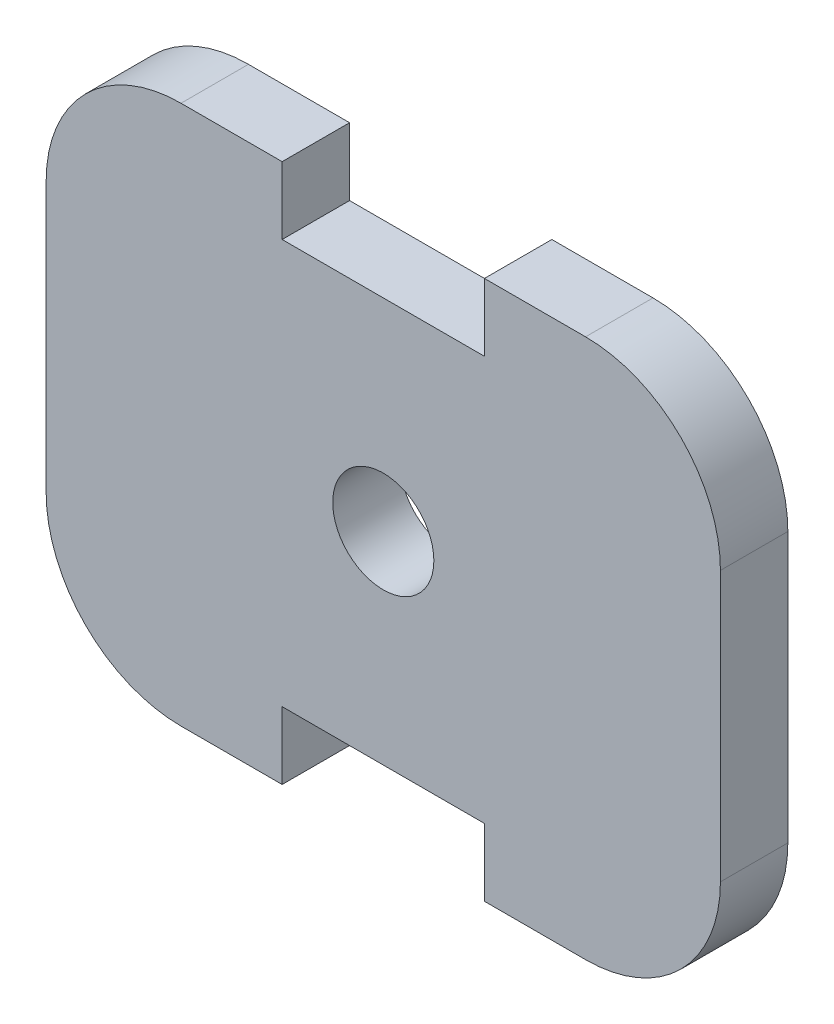
ISO-10303-21;
HEADER;
FILE_DESCRIPTION(('STEP AP214'),'2;1');
FILE_NAME('part.step','',(''),(''),'','','');
FILE_SCHEMA(('AUTOMOTIVE_DESIGN { 1 0 10303 214 1 1 1 1 }'));
ENDSEC;
DATA;
#1=APPLICATION_CONTEXT('core data for automotive mechanical design processes');
#2=APPLICATION_PROTOCOL_DEFINITION('international standard','automotive_design',2000,#1);
#3=PRODUCT_CONTEXT('',#1,'mechanical');
#4=PRODUCT('Part','Part','',(#3));
#5=PRODUCT_RELATED_PRODUCT_CATEGORY('part','',(#4));
#6=PRODUCT_DEFINITION_FORMATION('','',#4);
#7=PRODUCT_DEFINITION_CONTEXT('part definition',#1,'design');
#8=PRODUCT_DEFINITION('design','',#6,#7);
#9=PRODUCT_DEFINITION_SHAPE('','',#8);
#10=(LENGTH_UNIT() NAMED_UNIT(*) SI_UNIT(.MILLI.,.METRE.));
#11=(NAMED_UNIT(*) PLANE_ANGLE_UNIT() SI_UNIT($,.RADIAN.));
#12=(NAMED_UNIT(*) SI_UNIT($,.STERADIAN.) SOLID_ANGLE_UNIT());
#13=UNCERTAINTY_MEASURE_WITH_UNIT(LENGTH_MEASURE(1.E-05),#10,'distance_accuracy_value','');
#14=(GEOMETRIC_REPRESENTATION_CONTEXT(3) GLOBAL_UNCERTAINTY_ASSIGNED_CONTEXT((#13)) GLOBAL_UNIT_ASSIGNED_CONTEXT((#10,
#11,#12)) REPRESENTATION_CONTEXT('',''));
#15=CARTESIAN_POINT('',(0.,0.,0.));
#16=DIRECTION('',(0.,0.,1.));
#17=DIRECTION('',(1.,0.,0.));
#18=AXIS2_PLACEMENT_3D('',#15,#16,#17);
#19=CARTESIAN_POINT('',(-3.175,2.08700615845026,3.175));
#20=DIRECTION('',(0.,0.,-1.));
#21=DIRECTION('',(-1.,0.,0.));
#22=AXIS2_PLACEMENT_3D('',#19,#20,#21);
#23=PLANE('',#22);
#24=CARTESIAN_POINT('',(-3.175,2.08700615845026,3.175));
#25=DIRECTION('',(0.,0.,1.));
#26=DIRECTION('',(-1.,0.,0.));
#27=AXIS2_PLACEMENT_3D('',#24,#25,#26);
#28=CIRCLE('',#27,6.35);
#29=CARTESIAN_POINT('',(-9.525,2.08700615845026,3.175));
#30=VERTEX_POINT('',#29);
#31=CARTESIAN_POINT('',(-3.17499999999999,-4.26299384154974,3.175));
#32=VERTEX_POINT('',#31);
#33=EDGE_CURVE('E209',#30,#32,#28,.T.);
#34=ORIENTED_EDGE('',*,*,#33,.T.);
#35=DIRECTION('',(1.,0.,0.));
#36=VECTOR('',#35,1.);
#37=CARTESIAN_POINT('',(1.5875,-4.26299384154974,3.175));
#38=LINE('',#37,#36);
#39=CARTESIAN_POINT('',(1.5875,-4.26299384154974,3.175));
#40=VERTEX_POINT('',#39);
#41=EDGE_CURVE('E117',#32,#40,#38,.T.);
#42=ORIENTED_EDGE('',*,*,#41,.T.);
#43=DIRECTION('',(0.,1.,0.));
#44=VECTOR('',#43,1.);
#45=CARTESIAN_POINT('',(1.5875,-4.26299384154974,3.175));
#46=LINE('',#45,#44);
#47=CARTESIAN_POINT('',(1.5875,-1.08799384154974,3.175));
#48=VERTEX_POINT('',#47);
#49=EDGE_CURVE('E248',#40,#48,#46,.T.);
#50=ORIENTED_EDGE('',*,*,#49,.T.);
#51=DIRECTION('',(1.,0.,0.));
#52=VECTOR('',#51,1.);
#53=CARTESIAN_POINT('',(1.5875,-1.08799384154974,3.175));
#54=LINE('',#53,#52);
#55=CARTESIAN_POINT('',(11.1125,-1.08799384154974,3.175));
#56=VERTEX_POINT('',#55);
#57=EDGE_CURVE('E267',#48,#56,#54,.T.);
#58=ORIENTED_EDGE('',*,*,#57,.T.);
#59=DIRECTION('',(0.,-1.,0.));
#60=VECTOR('',#59,1.);
#61=CARTESIAN_POINT('',(11.1125,-4.26299384154974,3.175));
#62=LINE('',#61,#60);
#63=CARTESIAN_POINT('',(11.1125,-4.26299384154974,3.175));
#64=VERTEX_POINT('',#63);
#65=EDGE_CURVE('E264',#56,#64,#62,.T.);
#66=ORIENTED_EDGE('',*,*,#65,.T.);
#67=DIRECTION('',(1.,0.,0.));
#68=VECTOR('',#67,1.);
#69=CARTESIAN_POINT('',(15.875,-4.26299384154974,3.175));
#70=LINE('',#69,#68);
#71=CARTESIAN_POINT('',(15.875,-4.26299384154974,3.175));
#72=VERTEX_POINT('',#71);
#73=EDGE_CURVE('E266',#64,#72,#70,.T.);
#74=ORIENTED_EDGE('',*,*,#73,.T.);
#75=CARTESIAN_POINT('',(15.875,2.08700615845026,3.175));
#76=DIRECTION('',(0.,0.,1.));
#77=DIRECTION('',(1.,0.,0.));
#78=AXIS2_PLACEMENT_3D('',#75,#76,#77);
#79=CIRCLE('',#78,6.35);
#80=CARTESIAN_POINT('',(22.225,2.08700615845026,3.175));
#81=VERTEX_POINT('',#80);
#82=EDGE_CURVE('E269',#72,#81,#79,.T.);
#83=ORIENTED_EDGE('',*,*,#82,.T.);
#84=DIRECTION('',(0.,1.,0.));
#85=VECTOR('',#84,1.);
#86=CARTESIAN_POINT('',(22.225,2.08700615845026,3.175));
#87=LINE('',#86,#85);
#88=CARTESIAN_POINT('',(22.225,14.7870061584503,3.175));
#89=VERTEX_POINT('',#88);
#90=EDGE_CURVE('E275',#81,#89,#87,.T.);
#91=ORIENTED_EDGE('',*,*,#90,.T.);
#92=CARTESIAN_POINT('',(15.875,14.7870061584503,3.175));
#93=DIRECTION('',(0.,0.,1.));
#94=DIRECTION('',(1.,0.,0.));
#95=AXIS2_PLACEMENT_3D('',#92,#93,#94);
#96=CIRCLE('',#95,6.35);
#97=CARTESIAN_POINT('',(15.875,21.1370061584503,3.175));
#98=VERTEX_POINT('',#97);
#99=EDGE_CURVE('E277',#89,#98,#96,.T.);
#100=ORIENTED_EDGE('',*,*,#99,.T.);
#101=DIRECTION('',(-1.,0.,0.));
#102=VECTOR('',#101,1.);
#103=CARTESIAN_POINT('',(15.875,21.1370061584503,3.175));
#104=LINE('',#103,#102);
#105=CARTESIAN_POINT('',(11.1125,21.1370061584503,3.175));
#106=VERTEX_POINT('',#105);
#107=EDGE_CURVE('E279',#98,#106,#104,.T.);
#108=ORIENTED_EDGE('',*,*,#107,.T.);
#109=DIRECTION('',(0.,-1.,0.));
#110=VECTOR('',#109,1.);
#111=CARTESIAN_POINT('',(11.1125,21.1370061584503,3.175));
#112=LINE('',#111,#110);
#113=CARTESIAN_POINT('',(11.1125,17.9620061584503,3.175));
#114=VERTEX_POINT('',#113);
#115=EDGE_CURVE('E281',#106,#114,#112,.T.);
#116=ORIENTED_EDGE('',*,*,#115,.T.);
#117=DIRECTION('',(-1.,0.,0.));
#118=VECTOR('',#117,1.);
#119=CARTESIAN_POINT('',(1.5875,17.9620061584503,3.175));
#120=LINE('',#119,#118);
#121=CARTESIAN_POINT('',(1.5875,17.9620061584503,3.175));
#122=VERTEX_POINT('',#121);
#123=EDGE_CURVE('E283',#114,#122,#120,.T.);
#124=ORIENTED_EDGE('',*,*,#123,.T.);
#125=DIRECTION('',(0.,1.,0.));
#126=VECTOR('',#125,1.);
#127=CARTESIAN_POINT('',(1.58750000000001,21.1370061584503,3.175));
#128=LINE('',#127,#126);
#129=CARTESIAN_POINT('',(1.58750000000001,21.1370061584503,3.175));
#130=VERTEX_POINT('',#129);
#131=EDGE_CURVE('E160',#122,#130,#128,.T.);
#132=ORIENTED_EDGE('',*,*,#131,.T.);
#133=DIRECTION('',(-1.,0.,0.));
#134=VECTOR('',#133,1.);
#135=CARTESIAN_POINT('',(1.58750000000001,21.1370061584503,3.175));
#136=LINE('',#135,#134);
#137=CARTESIAN_POINT('',(-3.175,21.1370061584503,3.175));
#138=VERTEX_POINT('',#137);
#139=EDGE_CURVE('E154',#130,#138,#136,.T.);
#140=ORIENTED_EDGE('',*,*,#139,.T.);
#141=CARTESIAN_POINT('',(-3.175,14.7870061584503,3.175));
#142=DIRECTION('',(0.,0.,1.));
#143=DIRECTION('',(1.,0.,0.));
#144=AXIS2_PLACEMENT_3D('',#141,#142,#143);
#145=CIRCLE('',#144,6.35);
#146=CARTESIAN_POINT('',(-9.525,14.7870061584503,3.175));
#147=VERTEX_POINT('',#146);
#148=EDGE_CURVE('E158',#138,#147,#145,.T.);
#149=ORIENTED_EDGE('',*,*,#148,.T.);
#150=DIRECTION('',(0.,-1.,0.));
#151=VECTOR('',#150,1.);
#152=CARTESIAN_POINT('',(-9.525,2.08700615845026,3.175));
#153=LINE('',#152,#151);
#154=EDGE_CURVE('E50',#147,#30,#153,.T.);
#155=ORIENTED_EDGE('',*,*,#154,.T.);
#156=EDGE_LOOP('',(#34,#42,#50,#58,#66,#74,#83,#91,#100,#108,#116,#124,#132,#140,#149,#155));
#157=FACE_BOUND('',#156,.T.);
#158=CARTESIAN_POINT('',(6.35,8.43700615845026,3.175));
#159=DIRECTION('',(0.,0.,1.));
#160=DIRECTION('',(1.,0.,0.));
#161=AXIS2_PLACEMENT_3D('',#158,#159,#160);
#162=CIRCLE('',#161,2.38125);
#163=CARTESIAN_POINT('',(8.73125,8.43700615845026,3.175));
#164=VERTEX_POINT('',#163);
#165=EDGE_CURVE('E182',#164,#164,#162,.T.);
#166=ORIENTED_EDGE('',*,*,#165,.F.);
#167=EDGE_LOOP('',(#166));
#168=FACE_BOUND('',#167,.T.);
#169=ADVANCED_FACE('F33',(#157,#168),#23,.F.);
#170=CARTESIAN_POINT('',(-3.175,2.08700615845026,0.));
#171=DIRECTION('',(0.,0.,-1.));
#172=DIRECTION('',(-1.,0.,0.));
#173=AXIS2_PLACEMENT_3D('',#170,#171,#172);
#174=PLANE('',#173);
#175=CARTESIAN_POINT('',(-3.175,2.08700615845026,0.));
#176=DIRECTION('',(0.,0.,1.));
#177=DIRECTION('',(-1.,0.,0.));
#178=AXIS2_PLACEMENT_3D('',#175,#176,#177);
#179=CIRCLE('',#178,6.35);
#180=CARTESIAN_POINT('',(-9.525,2.08700615845026,0.));
#181=VERTEX_POINT('',#180);
#182=CARTESIAN_POINT('',(-3.17499999999999,-4.26299384154974,0.));
#183=VERTEX_POINT('',#182);
#184=EDGE_CURVE('E178',#181,#183,#179,.T.);
#185=ORIENTED_EDGE('',*,*,#184,.F.);
#186=DIRECTION('',(0.,-1.,0.));
#187=VECTOR('',#186,1.);
#188=CARTESIAN_POINT('',(-9.525,2.08700615845026,0.));
#189=LINE('',#188,#187);
#190=CARTESIAN_POINT('',(-9.525,14.7870061584503,0.));
#191=VERTEX_POINT('',#190);
#192=EDGE_CURVE('E109',#191,#181,#189,.T.);
#193=ORIENTED_EDGE('',*,*,#192,.F.);
#194=CARTESIAN_POINT('',(-3.175,14.7870061584503,0.));
#195=DIRECTION('',(0.,0.,1.));
#196=DIRECTION('',(1.,0.,0.));
#197=AXIS2_PLACEMENT_3D('',#194,#195,#196);
#198=CIRCLE('',#197,6.35);
#199=CARTESIAN_POINT('',(-3.175,21.1370061584503,0.));
#200=VERTEX_POINT('',#199);
#201=EDGE_CURVE('E103',#200,#191,#198,.T.);
#202=ORIENTED_EDGE('',*,*,#201,.F.);
#203=DIRECTION('',(-1.,0.,0.));
#204=VECTOR('',#203,1.);
#205=CARTESIAN_POINT('',(1.58750000000001,21.1370061584503,0.));
#206=LINE('',#205,#204);
#207=CARTESIAN_POINT('',(1.58750000000001,21.1370061584503,0.));
#208=VERTEX_POINT('',#207);
#209=EDGE_CURVE('E168',#208,#200,#206,.T.);
#210=ORIENTED_EDGE('',*,*,#209,.F.);
#211=DIRECTION('',(0.,1.,0.));
#212=VECTOR('',#211,1.);
#213=CARTESIAN_POINT('',(1.58750000000001,21.1370061584503,0.));
#214=LINE('',#213,#212);
#215=CARTESIAN_POINT('',(1.5875,17.9620061584503,0.));
#216=VERTEX_POINT('',#215);
#217=EDGE_CURVE('E204',#216,#208,#214,.T.);
#218=ORIENTED_EDGE('',*,*,#217,.F.);
#219=DIRECTION('',(-1.,0.,0.));
#220=VECTOR('',#219,1.);
#221=CARTESIAN_POINT('',(1.5875,17.9620061584503,0.));
#222=LINE('',#221,#220);
#223=CARTESIAN_POINT('',(11.1125,17.9620061584503,0.));
#224=VERTEX_POINT('',#223);
#225=EDGE_CURVE('E202',#224,#216,#222,.T.);
#226=ORIENTED_EDGE('',*,*,#225,.F.);
#227=DIRECTION('',(0.,-1.,0.));
#228=VECTOR('',#227,1.);
#229=CARTESIAN_POINT('',(11.1125,21.1370061584503,0.));
#230=LINE('',#229,#228);
#231=CARTESIAN_POINT('',(11.1125,21.1370061584503,0.));
#232=VERTEX_POINT('',#231);
#233=EDGE_CURVE('E200',#232,#224,#230,.T.);
#234=ORIENTED_EDGE('',*,*,#233,.F.);
#235=DIRECTION('',(-1.,0.,0.));
#236=VECTOR('',#235,1.);
#237=CARTESIAN_POINT('',(15.875,21.1370061584503,0.));
#238=LINE('',#237,#236);
#239=CARTESIAN_POINT('',(15.875,21.1370061584503,0.));
#240=VERTEX_POINT('',#239);
#241=EDGE_CURVE('E198',#240,#232,#238,.T.);
#242=ORIENTED_EDGE('',*,*,#241,.F.);
#243=CARTESIAN_POINT('',(15.875,14.7870061584503,0.));
#244=DIRECTION('',(0.,0.,1.));
#245=DIRECTION('',(1.,0.,0.));
#246=AXIS2_PLACEMENT_3D('',#243,#244,#245);
#247=CIRCLE('',#246,6.35);
#248=CARTESIAN_POINT('',(22.225,14.7870061584503,0.));
#249=VERTEX_POINT('',#248);
#250=EDGE_CURVE('E196',#249,#240,#247,.T.);
#251=ORIENTED_EDGE('',*,*,#250,.F.);
#252=DIRECTION('',(0.,1.,0.));
#253=VECTOR('',#252,1.);
#254=CARTESIAN_POINT('',(22.225,2.08700615845026,0.));
#255=LINE('',#254,#253);
#256=CARTESIAN_POINT('',(22.225,2.08700615845026,0.));
#257=VERTEX_POINT('',#256);
#258=EDGE_CURVE('E194',#257,#249,#255,.T.);
#259=ORIENTED_EDGE('',*,*,#258,.F.);
#260=CARTESIAN_POINT('',(15.875,2.08700615845026,0.));
#261=DIRECTION('',(0.,0.,1.));
#262=DIRECTION('',(1.,0.,0.));
#263=AXIS2_PLACEMENT_3D('',#260,#261,#262);
#264=CIRCLE('',#263,6.35);
#265=CARTESIAN_POINT('',(15.875,-4.26299384154974,0.));
#266=VERTEX_POINT('',#265);
#267=EDGE_CURVE('E192',#266,#257,#264,.T.);
#268=ORIENTED_EDGE('',*,*,#267,.F.);
#269=DIRECTION('',(1.,0.,0.));
#270=VECTOR('',#269,1.);
#271=CARTESIAN_POINT('',(15.875,-4.26299384154974,0.));
#272=LINE('',#271,#270);
#273=CARTESIAN_POINT('',(11.1125,-4.26299384154974,0.));
#274=VERTEX_POINT('',#273);
#275=EDGE_CURVE('E190',#274,#266,#272,.T.);
#276=ORIENTED_EDGE('',*,*,#275,.F.);
#277=DIRECTION('',(0.,-1.,0.));
#278=VECTOR('',#277,1.);
#279=CARTESIAN_POINT('',(11.1125,-4.26299384154974,0.));
#280=LINE('',#279,#278);
#281=CARTESIAN_POINT('',(11.1125,-1.08799384154974,0.));
#282=VERTEX_POINT('',#281);
#283=EDGE_CURVE('E188',#282,#274,#280,.T.);
#284=ORIENTED_EDGE('',*,*,#283,.F.);
#285=DIRECTION('',(1.,0.,0.));
#286=VECTOR('',#285,1.);
#287=CARTESIAN_POINT('',(1.5875,-1.08799384154974,0.));
#288=LINE('',#287,#286);
#289=CARTESIAN_POINT('',(1.5875,-1.08799384154974,0.));
#290=VERTEX_POINT('',#289);
#291=EDGE_CURVE('E186',#290,#282,#288,.T.);
#292=ORIENTED_EDGE('',*,*,#291,.F.);
#293=DIRECTION('',(0.,1.,0.));
#294=VECTOR('',#293,1.);
#295=CARTESIAN_POINT('',(1.5875,-4.26299384154974,0.));
#296=LINE('',#295,#294);
#297=CARTESIAN_POINT('',(1.5875,-4.26299384154974,0.));
#298=VERTEX_POINT('',#297);
#299=EDGE_CURVE('E184',#298,#290,#296,.T.);
#300=ORIENTED_EDGE('',*,*,#299,.F.);
#301=DIRECTION('',(1.,0.,0.));
#302=VECTOR('',#301,1.);
#303=CARTESIAN_POINT('',(1.5875,-4.26299384154974,0.));
#304=LINE('',#303,#302);
#305=EDGE_CURVE('E181',#183,#298,#304,.T.);
#306=ORIENTED_EDGE('',*,*,#305,.F.);
#307=EDGE_LOOP('',(#185,#193,#202,#210,#218,#226,#234,#242,#251,#259,#268,#276,#284,#292,#300,#306));
#308=FACE_BOUND('',#307,.T.);
#309=CARTESIAN_POINT('',(6.35,8.43700615845026,0.));
#310=DIRECTION('',(0.,0.,1.));
#311=DIRECTION('',(1.,0.,0.));
#312=AXIS2_PLACEMENT_3D('',#309,#310,#311);
#313=CIRCLE('',#312,2.38125);
#314=CARTESIAN_POINT('',(8.73125,8.43700615845026,0.));
#315=VERTEX_POINT('',#314);
#316=EDGE_CURVE('E482',#315,#315,#313,.T.);
#317=ORIENTED_EDGE('',*,*,#316,.T.);
#318=EDGE_LOOP('',(#317));
#319=FACE_BOUND('',#318,.T.);
#320=ADVANCED_FACE('F252',(#308,#319),#174,.T.);
#321=CARTESIAN_POINT('',(-3.175,2.08700615845026,3.175));
#322=DIRECTION('',(0.,0.,-1.));
#323=DIRECTION('',(-1.,0.,0.));
#324=AXIS2_PLACEMENT_3D('',#321,#322,#323);
#325=CYLINDRICAL_SURFACE('',#324,6.35);
#326=ORIENTED_EDGE('',*,*,#184,.T.);
#327=DIRECTION('',(0.,0.,-1.));
#328=VECTOR('',#327,1.);
#329=CARTESIAN_POINT('',(-3.17499999999999,-4.26299384154974,3.175));
#330=LINE('',#329,#328);
#331=EDGE_CURVE('E11',#32,#183,#330,.T.);
#332=ORIENTED_EDGE('',*,*,#331,.F.);
#333=ORIENTED_EDGE('',*,*,#33,.F.);
#334=DIRECTION('',(0.,0.,-1.));
#335=VECTOR('',#334,1.);
#336=CARTESIAN_POINT('',(-9.525,2.08700615845026,3.175));
#337=LINE('',#336,#335);
#338=EDGE_CURVE('E174',#30,#181,#337,.T.);
#339=ORIENTED_EDGE('',*,*,#338,.T.);
#340=EDGE_LOOP('',(#326,#332,#333,#339));
#341=FACE_BOUND('',#340,.T.);
#342=ADVANCED_FACE('F35',(#341),#325,.T.);
#343=CARTESIAN_POINT('',(1.5875,-4.26299384154974,3.175));
#344=DIRECTION('',(0.,1.,0.));
#345=DIRECTION('',(-1.,0.,0.));
#346=AXIS2_PLACEMENT_3D('',#343,#344,#345);
#347=PLANE('',#346);
#348=ORIENTED_EDGE('',*,*,#305,.T.);
#349=DIRECTION('',(0.,0.,-1.));
#350=VECTOR('',#349,1.);
#351=CARTESIAN_POINT('',(1.5875,-4.26299384154974,3.175));
#352=LINE('',#351,#350);
#353=EDGE_CURVE('E42',#40,#298,#352,.T.);
#354=ORIENTED_EDGE('',*,*,#353,.F.);
#355=ORIENTED_EDGE('',*,*,#41,.F.);
#356=ORIENTED_EDGE('',*,*,#331,.T.);
#357=EDGE_LOOP('',(#348,#354,#355,#356));
#358=FACE_BOUND('',#357,.T.);
#359=ADVANCED_FACE('F317',(#358),#347,.F.);
#360=CARTESIAN_POINT('',(1.5875,-4.26299384154974,3.175));
#361=DIRECTION('',(-1.,0.,0.));
#362=DIRECTION('',(0.,0.,1.));
#363=AXIS2_PLACEMENT_3D('',#360,#361,#362);
#364=PLANE('',#363);
#365=ORIENTED_EDGE('',*,*,#299,.T.);
#366=DIRECTION('',(0.,0.,-1.));
#367=VECTOR('',#366,1.);
#368=CARTESIAN_POINT('',(1.5875,-1.08799384154974,3.175));
#369=LINE('',#368,#367);
#370=EDGE_CURVE('E240',#48,#290,#369,.T.);
#371=ORIENTED_EDGE('',*,*,#370,.F.);
#372=ORIENTED_EDGE('',*,*,#49,.F.);
#373=ORIENTED_EDGE('',*,*,#353,.T.);
#374=EDGE_LOOP('',(#365,#371,#372,#373));
#375=FACE_BOUND('',#374,.T.);
#376=ADVANCED_FACE('F246',(#375),#364,.F.);
#377=CARTESIAN_POINT('',(1.5875,-1.08799384154974,3.175));
#378=DIRECTION('',(0.,1.,0.));
#379=DIRECTION('',(0.,0.,1.));
#380=AXIS2_PLACEMENT_3D('',#377,#378,#379);
#381=PLANE('',#380);
#382=ORIENTED_EDGE('',*,*,#291,.T.);
#383=DIRECTION('',(0.,0.,-1.));
#384=VECTOR('',#383,1.);
#385=CARTESIAN_POINT('',(11.1125,-1.08799384154974,3.175));
#386=LINE('',#385,#384);
#387=EDGE_CURVE('E237',#56,#282,#386,.T.);
#388=ORIENTED_EDGE('',*,*,#387,.F.);
#389=ORIENTED_EDGE('',*,*,#57,.F.);
#390=ORIENTED_EDGE('',*,*,#370,.T.);
#391=EDGE_LOOP('',(#382,#388,#389,#390));
#392=FACE_BOUND('',#391,.T.);
#393=ADVANCED_FACE('F258',(#392),#381,.F.);
#394=CARTESIAN_POINT('',(11.1125,-4.26299384154974,3.175));
#395=DIRECTION('',(1.,0.,0.));
#396=DIRECTION('',(0.,0.,-1.));
#397=AXIS2_PLACEMENT_3D('',#394,#395,#396);
#398=PLANE('',#397);
#399=ORIENTED_EDGE('',*,*,#283,.T.);
#400=DIRECTION('',(0.,0.,-1.));
#401=VECTOR('',#400,1.);
#402=CARTESIAN_POINT('',(11.1125,-4.26299384154974,3.175));
#403=LINE('',#402,#401);
#404=EDGE_CURVE('E234',#64,#274,#403,.T.);
#405=ORIENTED_EDGE('',*,*,#404,.F.);
#406=ORIENTED_EDGE('',*,*,#65,.F.);
#407=ORIENTED_EDGE('',*,*,#387,.T.);
#408=EDGE_LOOP('',(#399,#405,#406,#407));
#409=FACE_BOUND('',#408,.T.);
#410=ADVANCED_FACE('F262',(#409),#398,.F.);
#411=CARTESIAN_POINT('',(15.875,-4.26299384154974,3.175));
#412=DIRECTION('',(0.,1.,0.));
#413=DIRECTION('',(0.,0.,1.));
#414=AXIS2_PLACEMENT_3D('',#411,#412,#413);
#415=PLANE('',#414);
#416=ORIENTED_EDGE('',*,*,#275,.T.);
#417=DIRECTION('',(0.,0.,-1.));
#418=VECTOR('',#417,1.);
#419=CARTESIAN_POINT('',(15.875,-4.26299384154974,3.175));
#420=LINE('',#419,#418);
#421=EDGE_CURVE('E231',#72,#266,#420,.T.);
#422=ORIENTED_EDGE('',*,*,#421,.F.);
#423=ORIENTED_EDGE('',*,*,#73,.F.);
#424=ORIENTED_EDGE('',*,*,#404,.T.);
#425=EDGE_LOOP('',(#416,#422,#423,#424));
#426=FACE_BOUND('',#425,.T.);
#427=ADVANCED_FACE('F330',(#426),#415,.F.);
#428=CARTESIAN_POINT('',(15.875,2.08700615845026,3.175));
#429=DIRECTION('',(0.,0.,-1.));
#430=DIRECTION('',(-1.,0.,0.));
#431=AXIS2_PLACEMENT_3D('',#428,#429,#430);
#432=CYLINDRICAL_SURFACE('',#431,6.35);
#433=ORIENTED_EDGE('',*,*,#267,.T.);
#434=DIRECTION('',(0.,0.,-1.));
#435=VECTOR('',#434,1.);
#436=CARTESIAN_POINT('',(22.225,2.08700615845026,3.175));
#437=LINE('',#436,#435);
#438=EDGE_CURVE('E228',#81,#257,#437,.T.);
#439=ORIENTED_EDGE('',*,*,#438,.F.);
#440=ORIENTED_EDGE('',*,*,#82,.F.);
#441=ORIENTED_EDGE('',*,*,#421,.T.);
#442=EDGE_LOOP('',(#433,#439,#440,#441));
#443=FACE_BOUND('',#442,.T.);
#444=ADVANCED_FACE('F333',(#443),#432,.T.);
#445=CARTESIAN_POINT('',(22.225,2.08700615845026,3.175));
#446=DIRECTION('',(-1.,0.,0.));
#447=DIRECTION('',(0.,0.,1.));
#448=AXIS2_PLACEMENT_3D('',#445,#446,#447);
#449=PLANE('',#448);
#450=ORIENTED_EDGE('',*,*,#258,.T.);
#451=DIRECTION('',(0.,0.,-1.));
#452=VECTOR('',#451,1.);
#453=CARTESIAN_POINT('',(22.225,14.7870061584503,3.175));
#454=LINE('',#453,#452);
#455=EDGE_CURVE('E225',#89,#249,#454,.T.);
#456=ORIENTED_EDGE('',*,*,#455,.F.);
#457=ORIENTED_EDGE('',*,*,#90,.F.);
#458=ORIENTED_EDGE('',*,*,#438,.T.);
#459=EDGE_LOOP('',(#450,#456,#457,#458));
#460=FACE_BOUND('',#459,.T.);
#461=ADVANCED_FACE('F337',(#460),#449,.F.);
#462=CARTESIAN_POINT('',(15.875,14.7870061584503,3.175));
#463=DIRECTION('',(0.,0.,-1.));
#464=DIRECTION('',(-1.,0.,0.));
#465=AXIS2_PLACEMENT_3D('',#462,#463,#464);
#466=CYLINDRICAL_SURFACE('',#465,6.35);
#467=ORIENTED_EDGE('',*,*,#250,.T.);
#468=DIRECTION('',(0.,0.,-1.));
#469=VECTOR('',#468,1.);
#470=CARTESIAN_POINT('',(15.875,21.1370061584503,3.175));
#471=LINE('',#470,#469);
#472=EDGE_CURVE('E222',#98,#240,#471,.T.);
#473=ORIENTED_EDGE('',*,*,#472,.F.);
#474=ORIENTED_EDGE('',*,*,#99,.F.);
#475=ORIENTED_EDGE('',*,*,#455,.T.);
#476=EDGE_LOOP('',(#467,#473,#474,#475));
#477=FACE_BOUND('',#476,.T.);
#478=ADVANCED_FACE('F341',(#477),#466,.T.);
#479=CARTESIAN_POINT('',(15.875,21.1370061584503,3.175));
#480=DIRECTION('',(0.,-1.,0.));
#481=DIRECTION('',(0.,0.,-1.));
#482=AXIS2_PLACEMENT_3D('',#479,#480,#481);
#483=PLANE('',#482);
#484=ORIENTED_EDGE('',*,*,#241,.T.);
#485=DIRECTION('',(0.,0.,-1.));
#486=VECTOR('',#485,1.);
#487=CARTESIAN_POINT('',(11.1125,21.1370061584503,3.175));
#488=LINE('',#487,#486);
#489=EDGE_CURVE('E219',#106,#232,#488,.T.);
#490=ORIENTED_EDGE('',*,*,#489,.F.);
#491=ORIENTED_EDGE('',*,*,#107,.F.);
#492=ORIENTED_EDGE('',*,*,#472,.T.);
#493=EDGE_LOOP('',(#484,#490,#491,#492));
#494=FACE_BOUND('',#493,.T.);
#495=ADVANCED_FACE('F345',(#494),#483,.F.);
#496=CARTESIAN_POINT('',(11.1125,21.1370061584503,3.175));
#497=DIRECTION('',(1.,0.,0.));
#498=DIRECTION('',(0.,0.,-1.));
#499=AXIS2_PLACEMENT_3D('',#496,#497,#498);
#500=PLANE('',#499);
#501=ORIENTED_EDGE('',*,*,#233,.T.);
#502=DIRECTION('',(0.,0.,-1.));
#503=VECTOR('',#502,1.);
#504=CARTESIAN_POINT('',(11.1125,17.9620061584503,3.175));
#505=LINE('',#504,#503);
#506=EDGE_CURVE('E216',#114,#224,#505,.T.);
#507=ORIENTED_EDGE('',*,*,#506,.F.);
#508=ORIENTED_EDGE('',*,*,#115,.F.);
#509=ORIENTED_EDGE('',*,*,#489,.T.);
#510=EDGE_LOOP('',(#501,#507,#508,#509));
#511=FACE_BOUND('',#510,.T.);
#512=ADVANCED_FACE('F349',(#511),#500,.F.);
#513=CARTESIAN_POINT('',(1.5875,17.9620061584503,3.175));
#514=DIRECTION('',(0.,-1.,0.));
#515=DIRECTION('',(1.,0.,0.));
#516=AXIS2_PLACEMENT_3D('',#513,#514,#515);
#517=PLANE('',#516);
#518=ORIENTED_EDGE('',*,*,#225,.T.);
#519=DIRECTION('',(0.,0.,-1.));
#520=VECTOR('',#519,1.);
#521=CARTESIAN_POINT('',(1.5875,17.9620061584503,3.175));
#522=LINE('',#521,#520);
#523=EDGE_CURVE('E213',#122,#216,#522,.T.);
#524=ORIENTED_EDGE('',*,*,#523,.F.);
#525=ORIENTED_EDGE('',*,*,#123,.F.);
#526=ORIENTED_EDGE('',*,*,#506,.T.);
#527=EDGE_LOOP('',(#518,#524,#525,#526));
#528=FACE_BOUND('',#527,.T.);
#529=ADVANCED_FACE('F289',(#528),#517,.F.);
#530=CARTESIAN_POINT('',(1.58750000000001,21.1370061584503,3.175));
#531=DIRECTION('',(-1.,0.,0.));
#532=DIRECTION('',(0.,-1.,0.));
#533=AXIS2_PLACEMENT_3D('',#530,#531,#532);
#534=PLANE('',#533);
#535=ORIENTED_EDGE('',*,*,#217,.T.);
#536=DIRECTION('',(0.,0.,-1.));
#537=VECTOR('',#536,1.);
#538=CARTESIAN_POINT('',(1.58750000000001,21.1370061584503,3.175));
#539=LINE('',#538,#537);
#540=EDGE_CURVE('E169',#130,#208,#539,.T.);
#541=ORIENTED_EDGE('',*,*,#540,.F.);
#542=ORIENTED_EDGE('',*,*,#131,.F.);
#543=ORIENTED_EDGE('',*,*,#523,.T.);
#544=EDGE_LOOP('',(#535,#541,#542,#543));
#545=FACE_BOUND('',#544,.T.);
#546=ADVANCED_FACE('F293',(#545),#534,.F.);
#547=CARTESIAN_POINT('',(1.58750000000001,21.1370061584503,3.175));
#548=DIRECTION('',(0.,-1.,0.));
#549=DIRECTION('',(0.,0.,-1.));
#550=AXIS2_PLACEMENT_3D('',#547,#548,#549);
#551=PLANE('',#550);
#552=ORIENTED_EDGE('',*,*,#209,.T.);
#553=DIRECTION('',(0.,0.,-1.));
#554=VECTOR('',#553,1.);
#555=CARTESIAN_POINT('',(-3.175,21.1370061584503,3.175));
#556=LINE('',#555,#554);
#557=EDGE_CURVE('E165',#138,#200,#556,.T.);
#558=ORIENTED_EDGE('',*,*,#557,.F.);
#559=ORIENTED_EDGE('',*,*,#139,.F.);
#560=ORIENTED_EDGE('',*,*,#540,.T.);
#561=EDGE_LOOP('',(#552,#558,#559,#560));
#562=FACE_BOUND('',#561,.T.);
#563=ADVANCED_FACE('F166',(#562),#551,.F.);
#564=CARTESIAN_POINT('',(-3.175,14.7870061584503,3.175));
#565=DIRECTION('',(0.,0.,-1.));
#566=DIRECTION('',(-1.,0.,0.));
#567=AXIS2_PLACEMENT_3D('',#564,#565,#566);
#568=CYLINDRICAL_SURFACE('',#567,6.35);
#569=ORIENTED_EDGE('',*,*,#201,.T.);
#570=DIRECTION('',(0.,0.,-1.));
#571=VECTOR('',#570,1.);
#572=CARTESIAN_POINT('',(-9.525,14.7870061584503,3.175));
#573=LINE('',#572,#571);
#574=EDGE_CURVE('E170',#147,#191,#573,.T.);
#575=ORIENTED_EDGE('',*,*,#574,.F.);
#576=ORIENTED_EDGE('',*,*,#148,.F.);
#577=ORIENTED_EDGE('',*,*,#557,.T.);
#578=EDGE_LOOP('',(#569,#575,#576,#577));
#579=FACE_BOUND('',#578,.T.);
#580=ADVANCED_FACE('F172',(#579),#568,.T.);
#581=CARTESIAN_POINT('',(-9.525,2.08700615845026,3.175));
#582=DIRECTION('',(1.,0.,0.));
#583=DIRECTION('',(0.,0.,-1.));
#584=AXIS2_PLACEMENT_3D('',#581,#582,#583);
#585=PLANE('',#584);
#586=ORIENTED_EDGE('',*,*,#192,.T.);
#587=ORIENTED_EDGE('',*,*,#338,.F.);
#588=ORIENTED_EDGE('',*,*,#154,.F.);
#589=ORIENTED_EDGE('',*,*,#574,.T.);
#590=EDGE_LOOP('',(#586,#587,#588,#589));
#591=FACE_BOUND('',#590,.T.);
#592=ADVANCED_FACE('F297',(#591),#585,.F.);
#593=CARTESIAN_POINT('',(6.35,8.43700615845026,3.175));
#594=DIRECTION('',(0.,0.,-1.));
#595=DIRECTION('',(-1.,0.,0.));
#596=AXIS2_PLACEMENT_3D('',#593,#594,#595);
#597=CYLINDRICAL_SURFACE('',#596,2.38125);
#598=ORIENTED_EDGE('',*,*,#165,.T.);
#599=EDGE_LOOP('',(#598));
#600=FACE_BOUND('',#599,.T.);
#601=ORIENTED_EDGE('',*,*,#316,.F.);
#602=EDGE_LOOP('',(#601));
#603=FACE_BOUND('',#602,.T.);
#604=ADVANCED_FACE('F299',(#600,#603),#597,.F.);
#605=CLOSED_SHELL('',(#169,#320,#342,#359,#376,#393,#410,#427,#444,#461,#478,#495,#512,#529,
#546,#563,#580,#592,#604));
#606=MANIFOLD_SOLID_BREP('B2',#605);
#607=ADVANCED_BREP_SHAPE_REPRESENTATION('',(#18,#606),#14);
#608=SHAPE_DEFINITION_REPRESENTATION(#9,#607);
ENDSEC;
END-ISO-10303-21;
